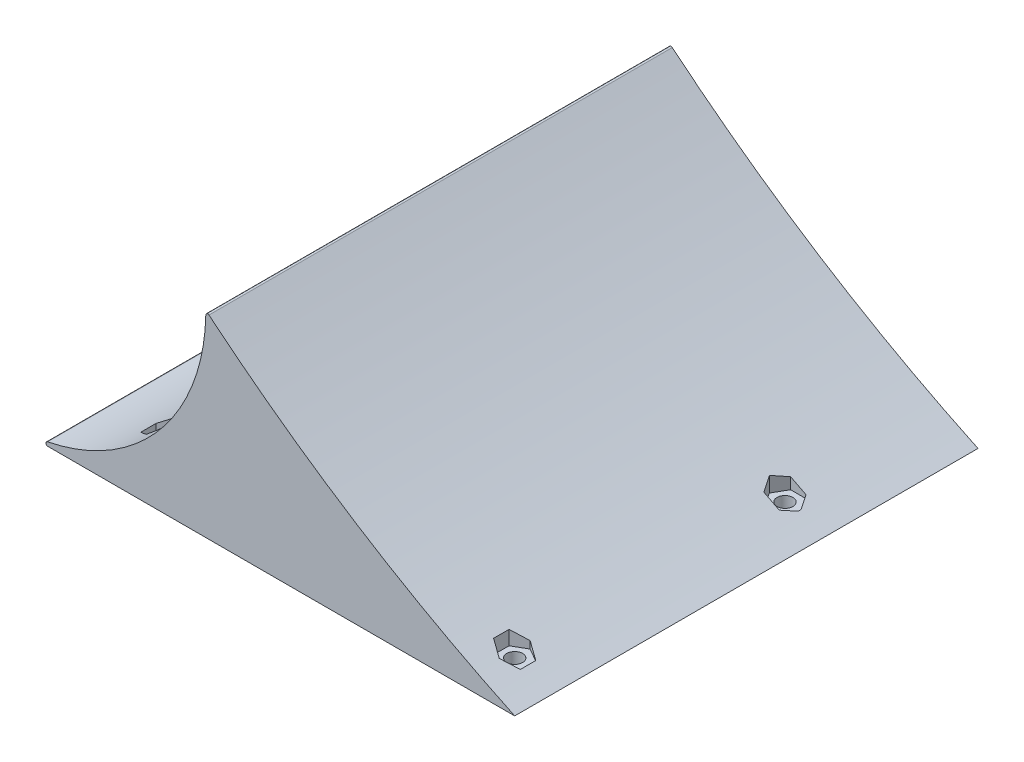
ISO-10303-21;
HEADER;
FILE_DESCRIPTION(('STEP AP214'),'2;1');
FILE_NAME('part.step','',(''),(''),'','','');
FILE_SCHEMA(('AUTOMOTIVE_DESIGN { 1 0 10303 214 1 1 1 1 }'));
ENDSEC;
DATA;
#1=APPLICATION_CONTEXT('core data for automotive mechanical design processes');
#2=APPLICATION_PROTOCOL_DEFINITION('international standard','automotive_design',2000,#1);
#3=PRODUCT_CONTEXT('',#1,'mechanical');
#4=PRODUCT('Part','Part','',(#3));
#5=PRODUCT_RELATED_PRODUCT_CATEGORY('part','',(#4));
#6=PRODUCT_DEFINITION_FORMATION('','',#4);
#7=PRODUCT_DEFINITION_CONTEXT('part definition',#1,'design');
#8=PRODUCT_DEFINITION('design','',#6,#7);
#9=PRODUCT_DEFINITION_SHAPE('','',#8);
#10=(LENGTH_UNIT() NAMED_UNIT(*) SI_UNIT(.MILLI.,.METRE.));
#11=(NAMED_UNIT(*) PLANE_ANGLE_UNIT() SI_UNIT($,.RADIAN.));
#12=(NAMED_UNIT(*) SI_UNIT($,.STERADIAN.) SOLID_ANGLE_UNIT());
#13=UNCERTAINTY_MEASURE_WITH_UNIT(LENGTH_MEASURE(1.E-05),#10,'distance_accuracy_value','');
#14=(GEOMETRIC_REPRESENTATION_CONTEXT(3) GLOBAL_UNCERTAINTY_ASSIGNED_CONTEXT((#13)) GLOBAL_UNIT_ASSIGNED_CONTEXT((#10,
#11,#12)) REPRESENTATION_CONTEXT('',''));
#15=CARTESIAN_POINT('',(0.,0.,0.));
#16=DIRECTION('',(0.,0.,1.));
#17=DIRECTION('',(1.,0.,0.));
#18=AXIS2_PLACEMENT_3D('',#15,#16,#17);
#19=CARTESIAN_POINT('',(0.,-51.,120.));
#20=DIRECTION('',(0.,-1.,0.));
#21=DIRECTION('',(1.,0.,0.));
#22=AXIS2_PLACEMENT_3D('',#19,#20,#21);
#23=PLANE('',#22);
#24=DIRECTION('',(-1.,0.,0.));
#25=VECTOR('',#24,1.);
#26=CARTESIAN_POINT('',(0.,-51.,0.));
#27=LINE('',#26,#25);
#28=CARTESIAN_POINT('',(131.,-51.,0.));
#29=VERTEX_POINT('',#28);
#30=CARTESIAN_POINT('',(10.0995049383621,-51.,0.));
#31=VERTEX_POINT('',#30);
#32=EDGE_CURVE('E423',#29,#31,#27,.T.);
#33=ORIENTED_EDGE('',*,*,#32,.F.);
#34=DIRECTION('',(0.,0.,-1.));
#35=VECTOR('',#34,1.);
#36=CARTESIAN_POINT('',(131.,-51.,120.));
#37=LINE('',#36,#35);
#38=CARTESIAN_POINT('',(131.,-51.,120.));
#39=VERTEX_POINT('',#38);
#40=EDGE_CURVE('E209',#39,#29,#37,.T.);
#41=ORIENTED_EDGE('',*,*,#40,.F.);
#42=DIRECTION('',(-1.,0.,0.));
#43=VECTOR('',#42,1.);
#44=CARTESIAN_POINT('',(0.,-51.,120.));
#45=LINE('',#44,#43);
#46=CARTESIAN_POINT('',(10.0995049383621,-51.,120.));
#47=VERTEX_POINT('',#46);
#48=EDGE_CURVE('E389',#39,#47,#45,.T.);
#49=ORIENTED_EDGE('',*,*,#48,.T.);
#50=DIRECTION('',(0.,0.,-1.));
#51=VECTOR('',#50,1.);
#52=CARTESIAN_POINT('',(10.0995049383621,-51.,120.));
#53=LINE('',#52,#51);
#54=EDGE_CURVE('E398',#47,#31,#53,.T.);
#55=ORIENTED_EDGE('',*,*,#54,.T.);
#56=EDGE_LOOP('',(#33,#41,#49,#55));
#57=FACE_BOUND('',#56,.T.);
#58=CARTESIAN_POINT('',(121.,-51.,110.));
#59=DIRECTION('',(0.,-1.,0.));
#60=DIRECTION('',(1.,0.,0.));
#61=AXIS2_PLACEMENT_3D('',#58,#59,#60);
#62=CIRCLE('',#61,2.05000000000001);
#63=CARTESIAN_POINT('',(123.05,-51.,110.));
#64=VERTEX_POINT('',#63);
#65=EDGE_CURVE('E282',#64,#64,#62,.F.);
#66=ORIENTED_EDGE('',*,*,#65,.T.);
#67=EDGE_LOOP('',(#66));
#68=FACE_BOUND('',#67,.T.);
#69=CARTESIAN_POINT('',(121.,-51.,40.));
#70=DIRECTION('',(0.,-1.,0.));
#71=DIRECTION('',(1.,0.,0.));
#72=AXIS2_PLACEMENT_3D('',#69,#70,#71);
#73=CIRCLE('',#72,2.04999999999999);
#74=CARTESIAN_POINT('',(123.05,-51.,40.));
#75=VERTEX_POINT('',#74);
#76=EDGE_CURVE('E283',#75,#75,#73,.T.);
#77=ORIENTED_EDGE('',*,*,#76,.F.);
#78=EDGE_LOOP('',(#77));
#79=FACE_BOUND('',#78,.T.);
#80=CARTESIAN_POINT('',(29.5995049383621,-51.,110.));
#81=DIRECTION('',(0.,-1.,0.));
#82=DIRECTION('',(1.,0.,0.));
#83=AXIS2_PLACEMENT_3D('',#80,#81,#82);
#84=CIRCLE('',#83,2.05000000000001);
#85=CARTESIAN_POINT('',(31.6495049383621,-51.,110.));
#86=VERTEX_POINT('',#85);
#87=EDGE_CURVE('E279',#86,#86,#84,.T.);
#88=ORIENTED_EDGE('',*,*,#87,.F.);
#89=EDGE_LOOP('',(#88));
#90=FACE_BOUND('',#89,.T.);
#91=ADVANCED_FACE('F42',(#57,#68,#79,#90),#23,.T.);
#92=CARTESIAN_POINT('',(0.,0.,120.));
#93=DIRECTION('',(0.,0.,-1.));
#94=DIRECTION('',(-1.,0.,0.));
#95=AXIS2_PLACEMENT_3D('',#92,#93,#94);
#96=CYLINDRICAL_SURFACE('',#95,51.);
#97=CARTESIAN_POINT('',(0.,0.,0.));
#98=DIRECTION('',(0.,0.,1.));
#99=DIRECTION('',(1.,0.,0.));
#100=AXIS2_PLACEMENT_3D('',#97,#98,#99);
#101=CIRCLE('',#100,51.);
#102=CARTESIAN_POINT('',(10.0014514923586,-50.0097087378641,0.));
#103=VERTEX_POINT('',#102);
#104=CARTESIAN_POINT('',(50.9892838253327,-1.04543530630317,0.));
#105=VERTEX_POINT('',#104);
#106=EDGE_CURVE('E57',#103,#105,#101,.T.);
#107=ORIENTED_EDGE('',*,*,#106,.F.);
#108=DIRECTION('',(0.,0.,-1.));
#109=VECTOR('',#108,1.);
#110=CARTESIAN_POINT('',(10.0014514923586,-50.0097087378641,120.));
#111=LINE('',#110,#109);
#112=CARTESIAN_POINT('',(10.0014514923586,-50.0097087378641,120.));
#113=VERTEX_POINT('',#112);
#114=EDGE_CURVE('E405',#103,#113,#111,.F.);
#115=ORIENTED_EDGE('',*,*,#114,.T.);
#116=CARTESIAN_POINT('',(0.,0.,120.));
#117=DIRECTION('',(0.,0.,1.));
#118=DIRECTION('',(1.,0.,0.));
#119=AXIS2_PLACEMENT_3D('',#116,#117,#118);
#120=CIRCLE('',#119,51.);
#121=CARTESIAN_POINT('',(50.9892838253327,-1.04543530630317,120.));
#122=VERTEX_POINT('',#121);
#123=EDGE_CURVE('E385',#113,#122,#120,.T.);
#124=ORIENTED_EDGE('',*,*,#123,.T.);
#125=DIRECTION('',(0.,0.,-1.));
#126=VECTOR('',#125,1.);
#127=CARTESIAN_POINT('',(50.9892838253327,-1.04543530630317,120.));
#128=LINE('',#127,#126);
#129=EDGE_CURVE('E402',#122,#105,#128,.T.);
#130=ORIENTED_EDGE('',*,*,#129,.T.);
#131=EDGE_LOOP('',(#107,#115,#124,#130));
#132=FACE_BOUND('',#131,.T.);
#133=CARTESIAN_POINT('',(0.,0.,123.089282144043));
#134=DIRECTION('',(-0.500000000000002,0.,-0.866025403784438));
#135=DIRECTION('',(0.866025403784438,0.,-0.500000000000002));
#136=AXIS2_PLACEMENT_3D('',#133,#134,#135);
#137=ELLIPSE('',#136,58.8897274573419,51.);
#138=CARTESIAN_POINT('',(29.5995049383621,-41.5315459308208,106.));
#139=VERTEX_POINT('',#138);
#140=CARTESIAN_POINT('',(26.1354033232243,-43.794299778994,108.));
#141=VERTEX_POINT('',#140);
#142=EDGE_CURVE('E51',#139,#141,#137,.T.);
#143=ORIENTED_EDGE('',*,*,#142,.F.);
#144=CARTESIAN_POINT('',(0.,0.,88.9107178559569));
#145=DIRECTION('',(0.500000000000002,0.,-0.866025403784438));
#146=DIRECTION('',(-0.866025403784438,0.,-0.500000000000002));
#147=AXIS2_PLACEMENT_3D('',#144,#145,#146);
#148=ELLIPSE('',#147,58.8897274573419,51.);
#149=CARTESIAN_POINT('',(33.0636065534998,-38.830373699919,108.));
#150=VERTEX_POINT('',#149);
#151=EDGE_CURVE('E262',#150,#139,#148,.T.);
#152=ORIENTED_EDGE('',*,*,#151,.F.);
#153=DIRECTION('',(0.,0.,-1.));
#154=VECTOR('',#153,1.);
#155=CARTESIAN_POINT('',(33.0636065534998,-38.830373699919,120.));
#156=LINE('',#155,#154);
#157=CARTESIAN_POINT('',(33.0636065534998,-38.830373699919,112.));
#158=VERTEX_POINT('',#157);
#159=EDGE_CURVE('E265',#158,#150,#156,.T.);
#160=ORIENTED_EDGE('',*,*,#159,.F.);
#161=CARTESIAN_POINT('',(0.,0.,131.089282144043));
#162=DIRECTION('',(0.499999999999999,0.,0.866025403784439));
#163=DIRECTION('',(0.866025403784439,0.,-0.499999999999999));
#164=AXIS2_PLACEMENT_3D('',#161,#162,#163);
#165=ELLIPSE('',#164,58.8897274573418,51.);
#166=CARTESIAN_POINT('',(29.5995049383621,-41.5315459308208,114.));
#167=VERTEX_POINT('',#166);
#168=EDGE_CURVE('E268',#167,#158,#165,.T.);
#169=ORIENTED_EDGE('',*,*,#168,.F.);
#170=CARTESIAN_POINT('',(0.,0.,96.910717855957));
#171=DIRECTION('',(-0.499999999999999,0.,0.866025403784439));
#172=DIRECTION('',(-0.866025403784439,0.,-0.499999999999999));
#173=AXIS2_PLACEMENT_3D('',#170,#171,#172);
#174=ELLIPSE('',#173,58.8897274573418,51.);
#175=CARTESIAN_POINT('',(26.1354033232243,-43.794299778994,112.));
#176=VERTEX_POINT('',#175);
#177=EDGE_CURVE('E271',#176,#167,#174,.T.);
#178=ORIENTED_EDGE('',*,*,#177,.F.);
#179=DIRECTION('',(0.,0.,-1.));
#180=VECTOR('',#179,1.);
#181=CARTESIAN_POINT('',(26.1354033232243,-43.794299778994,120.));
#182=LINE('',#181,#180);
#183=EDGE_CURVE('E274',#141,#176,#182,.F.);
#184=ORIENTED_EDGE('',*,*,#183,.F.);
#185=EDGE_LOOP('',(#143,#152,#160,#169,#178,#184));
#186=FACE_BOUND('',#185,.T.);
#187=ADVANCED_FACE('F414',(#132,#186),#96,.F.);
#188=CARTESIAN_POINT('',(291.444081503328,288.922088632672,120.));
#189=DIRECTION('',(0.,0.,-1.));
#190=DIRECTION('',(-1.,0.,0.));
#191=AXIS2_PLACEMENT_3D('',#188,#189,#190);
#192=CYLINDRICAL_SURFACE('',#191,375.884729178833);
#193=CARTESIAN_POINT('',(291.444081503328,288.922088632672,0.));
#194=DIRECTION('',(0.,0.,1.));
#195=DIRECTION('',(1.,0.,0.));
#196=AXIS2_PLACEMENT_3D('',#193,#194,#195);
#197=CIRCLE('',#196,375.884729178833);
#198=CARTESIAN_POINT('',(51.8079415680354,-0.670470088641643,0.));
#199=VERTEX_POINT('',#198);
#200=EDGE_CURVE('E196',#199,#29,#197,.T.);
#201=ORIENTED_EDGE('',*,*,#200,.F.);
#202=DIRECTION('',(0.,0.,-1.));
#203=VECTOR('',#202,1.);
#204=CARTESIAN_POINT('',(51.8079415680354,-0.670470088641684,120.));
#205=LINE('',#204,#203);
#206=CARTESIAN_POINT('',(51.8079415680354,-0.670470088641628,120.));
#207=VERTEX_POINT('',#206);
#208=EDGE_CURVE('E206',#199,#207,#205,.F.);
#209=ORIENTED_EDGE('',*,*,#208,.T.);
#210=CARTESIAN_POINT('',(291.444081503328,288.922088632672,120.));
#211=DIRECTION('',(0.,0.,1.));
#212=DIRECTION('',(1.,0.,0.));
#213=AXIS2_PLACEMENT_3D('',#210,#211,#212);
#214=CIRCLE('',#213,375.884729178833);
#215=EDGE_CURVE('E393',#207,#39,#214,.T.);
#216=ORIENTED_EDGE('',*,*,#215,.T.);
#217=ORIENTED_EDGE('',*,*,#40,.T.);
#218=EDGE_LOOP('',(#201,#209,#216,#217));
#219=FACE_BOUND('',#218,.T.);
#220=CARTESIAN_POINT('',(291.444081503328,288.922088632672,-262.146012243449));
#221=DIRECTION('',(-0.866025403784438,0.,-0.500000000000002));
#222=DIRECTION('',(0.500000000000002,0.,-0.866025403784438));
#223=AXIS2_PLACEMENT_3D('',#220,#221,#222);
#224=ELLIPSE('',#223,751.769458357663,375.884729178833);
#225=CARTESIAN_POINT('',(119.,-45.0724747726598,36.5358983848623));
#226=VERTEX_POINT('',#225);
#227=CARTESIAN_POINT('',(117.,-44.0322506667354,40.));
#228=VERTEX_POINT('',#227);
#229=EDGE_CURVE('E259',#226,#228,#224,.T.);
#230=ORIENTED_EDGE('',*,*,#229,.F.);
#231=CARTESIAN_POINT('',(291.444081503328,288.922088632672,36.5358983848623));
#232=DIRECTION('',(0.,0.,-1.));
#233=DIRECTION('',(-1.,0.,0.));
#234=AXIS2_PLACEMENT_3D('',#231,#232,#233);
#235=CIRCLE('',#234,375.884729178833);
#236=CARTESIAN_POINT('',(123.,-47.1075544590422,36.5358983848623));
#237=VERTEX_POINT('',#236);
#238=EDGE_CURVE('E243',#237,#226,#235,.T.);
#239=ORIENTED_EDGE('',*,*,#238,.F.);
#240=CARTESIAN_POINT('',(291.444081503328,288.922088632672,328.289605782896));
#241=DIRECTION('',(0.866025403784436,0.,-0.500000000000004));
#242=DIRECTION('',(-0.500000000000004,0.,-0.866025403784436));
#243=AXIS2_PLACEMENT_3D('',#240,#241,#242);
#244=ELLIPSE('',#243,751.769458357659,375.884729178833);
#245=CARTESIAN_POINT('',(124.792241365745,-48.,39.640151489759));
#246=VERTEX_POINT('',#245);
#247=EDGE_CURVE('E240',#246,#237,#244,.T.);
#248=ORIENTED_EDGE('',*,*,#247,.F.);
#249=DIRECTION('',(0.,0.,-1.));
#250=VECTOR('',#249,1.);
#251=CARTESIAN_POINT('',(124.792241365745,-48.,120.));
#252=LINE('',#251,#250);
#253=CARTESIAN_POINT('',(124.792241365745,-48.,40.3598485102411));
#254=VERTEX_POINT('',#253);
#255=EDGE_CURVE('E246',#254,#246,#252,.T.);
#256=ORIENTED_EDGE('',*,*,#255,.F.);
#257=CARTESIAN_POINT('',(291.444081503328,288.922088632672,-248.289605782895));
#258=DIRECTION('',(0.866025403784435,0.,0.500000000000006));
#259=DIRECTION('',(0.500000000000006,0.,-0.866025403784435));
#260=AXIS2_PLACEMENT_3D('',#257,#258,#259);
#261=ELLIPSE('',#260,751.769458357657,375.884729178833);
#262=CARTESIAN_POINT('',(123.,-47.1075544590422,43.4641016151377));
#263=VERTEX_POINT('',#262);
#264=EDGE_CURVE('E250',#263,#254,#261,.T.);
#265=ORIENTED_EDGE('',*,*,#264,.F.);
#266=CARTESIAN_POINT('',(291.444081503328,288.922088632672,43.4641016151377));
#267=DIRECTION('',(0.,0.,1.));
#268=DIRECTION('',(1.,0.,0.));
#269=AXIS2_PLACEMENT_3D('',#266,#267,#268);
#270=CIRCLE('',#269,375.884729178833);
#271=CARTESIAN_POINT('',(119.,-45.0724747726599,43.4641016151377));
#272=VERTEX_POINT('',#271);
#273=EDGE_CURVE('E253',#272,#263,#270,.T.);
#274=ORIENTED_EDGE('',*,*,#273,.F.);
#275=CARTESIAN_POINT('',(291.444081503328,288.922088632672,342.146012243452));
#276=DIRECTION('',(-0.86602540378444,0.,0.499999999999998));
#277=DIRECTION('',(-0.499999999999998,0.,-0.86602540378444));
#278=AXIS2_PLACEMENT_3D('',#275,#276,#277);
#279=ELLIPSE('',#278,751.769458357668,375.884729178833);
#280=EDGE_CURVE('E256',#228,#272,#279,.T.);
#281=ORIENTED_EDGE('',*,*,#280,.F.);
#282=EDGE_LOOP('',(#230,#239,#248,#256,#265,#274,#281));
#283=FACE_BOUND('',#282,.T.);
#284=DIRECTION('',(0.,0.,-1.));
#285=VECTOR('',#284,1.);
#286=CARTESIAN_POINT('',(124.464101615138,-47.8374931855507,120.));
#287=LINE('',#286,#285);
#288=CARTESIAN_POINT('',(124.464101615138,-47.8374931855507,112.));
#289=VERTEX_POINT('',#288);
#290=CARTESIAN_POINT('',(124.464101615138,-47.8374931855508,108.));
#291=VERTEX_POINT('',#290);
#292=EDGE_CURVE('E237',#289,#291,#287,.T.);
#293=ORIENTED_EDGE('',*,*,#292,.F.);
#294=CARTESIAN_POINT('',(291.444081503328,288.922088632672,15.5940636622761));
#295=DIRECTION('',(0.499999999999996,0.,0.866025403784441));
#296=DIRECTION('',(0.866025403784441,0.,-0.499999999999996));
#297=AXIS2_PLACEMENT_3D('',#294,#295,#296);
#298=ELLIPSE('',#297,434.034299151336,375.884729178833);
#299=CARTESIAN_POINT('',(121.,-46.0975297635221,114.));
#300=VERTEX_POINT('',#299);
#301=EDGE_CURVE('E215',#300,#289,#298,.T.);
#302=ORIENTED_EDGE('',*,*,#301,.F.);
#303=CARTESIAN_POINT('',(291.444081503328,288.922088632672,212.405936337725));
#304=DIRECTION('',(-0.5,0.,0.866025403784438));
#305=DIRECTION('',(-0.866025403784438,0.,-0.5));
#306=AXIS2_PLACEMENT_3D('',#303,#304,#305);
#307=ELLIPSE('',#306,434.034299151338,375.884729178833);
#308=CARTESIAN_POINT('',(117.535898384862,-44.312473611821,112.));
#309=VERTEX_POINT('',#308);
#310=EDGE_CURVE('E220',#309,#300,#307,.T.);
#311=ORIENTED_EDGE('',*,*,#310,.F.);
#312=DIRECTION('',(0.,0.,-1.));
#313=VECTOR('',#312,1.);
#314=CARTESIAN_POINT('',(117.535898384862,-44.3124736118209,120.));
#315=LINE('',#314,#313);
#316=CARTESIAN_POINT('',(117.535898384862,-44.3124736118209,108.));
#317=VERTEX_POINT('',#316);
#318=EDGE_CURVE('E228',#317,#309,#315,.F.);
#319=ORIENTED_EDGE('',*,*,#318,.F.);
#320=CARTESIAN_POINT('',(291.444081503328,288.922088632672,7.59406366227533));
#321=DIRECTION('',(-0.499999999999999,0.,-0.866025403784439));
#322=DIRECTION('',(0.866025403784439,0.,-0.499999999999999));
#323=AXIS2_PLACEMENT_3D('',#320,#321,#322);
#324=ELLIPSE('',#323,434.034299151337,375.884729178833);
#325=CARTESIAN_POINT('',(121.,-46.0975297635221,106.));
#326=VERTEX_POINT('',#325);
#327=EDGE_CURVE('E231',#326,#317,#324,.T.);
#328=ORIENTED_EDGE('',*,*,#327,.F.);
#329=CARTESIAN_POINT('',(291.444081503328,288.922088632672,204.405936337724));
#330=DIRECTION('',(0.499999999999997,0.,-0.86602540378444));
#331=DIRECTION('',(-0.86602540378444,0.,-0.499999999999998));
#332=AXIS2_PLACEMENT_3D('',#329,#330,#331);
#333=ELLIPSE('',#332,434.034299151337,375.884729178833);
#334=EDGE_CURVE('E234',#291,#326,#333,.T.);
#335=ORIENTED_EDGE('',*,*,#334,.F.);
#336=EDGE_LOOP('',(#293,#302,#311,#319,#328,#335));
#337=FACE_BOUND('',#336,.T.);
#338=ADVANCED_FACE('F204',(#219,#283,#337),#192,.F.);
#339=CARTESIAN_POINT('',(0.,0.,120.));
#340=DIRECTION('',(0.,0.,1.));
#341=DIRECTION('',(1.,0.,0.));
#342=AXIS2_PLACEMENT_3D('',#339,#340,#341);
#343=PLANE('',#342);
#344=ORIENTED_EDGE('',*,*,#123,.F.);
#345=CARTESIAN_POINT('',(10.0995049383621,-50.5,120.));
#346=DIRECTION('',(0.,0.,1.));
#347=DIRECTION('',(1.,0.,0.));
#348=AXIS2_PLACEMENT_3D('',#345,#346,#347);
#349=CIRCLE('',#348,0.5);
#350=EDGE_CURVE('E216',#113,#47,#349,.T.);
#351=ORIENTED_EDGE('',*,*,#350,.T.);
#352=ORIENTED_EDGE('',*,*,#48,.F.);
#353=ORIENTED_EDGE('',*,*,#215,.F.);
#354=CARTESIAN_POINT('',(51.4891787647967,-1.05568467205124,120.));
#355=DIRECTION('',(0.,0.,1.));
#356=DIRECTION('',(1.,0.,0.));
#357=AXIS2_PLACEMENT_3D('',#354,#355,#356);
#358=CIRCLE('',#357,0.5);
#359=EDGE_CURVE('E213',#207,#122,#358,.T.);
#360=ORIENTED_EDGE('',*,*,#359,.T.);
#361=EDGE_LOOP('',(#344,#351,#352,#353,#360));
#362=FACE_BOUND('',#361,.T.);
#363=ADVANCED_FACE('F410',(#362),#343,.T.);
#364=CARTESIAN_POINT('',(10.0995049383621,-50.5,120.));
#365=DIRECTION('',(0.,0.,-1.));
#366=DIRECTION('',(-1.,0.,0.));
#367=AXIS2_PLACEMENT_3D('',#364,#365,#366);
#368=CYLINDRICAL_SURFACE('',#367,0.5);
#369=CARTESIAN_POINT('',(10.0995049383621,-50.5,0.));
#370=DIRECTION('',(0.,0.,1.));
#371=DIRECTION('',(1.,0.,0.));
#372=AXIS2_PLACEMENT_3D('',#369,#370,#371);
#373=CIRCLE('',#372,0.5);
#374=EDGE_CURVE('E421',#31,#103,#373,.F.);
#375=ORIENTED_EDGE('',*,*,#374,.F.);
#376=ORIENTED_EDGE('',*,*,#54,.F.);
#377=ORIENTED_EDGE('',*,*,#350,.F.);
#378=ORIENTED_EDGE('',*,*,#114,.F.);
#379=EDGE_LOOP('',(#375,#376,#377,#378));
#380=FACE_BOUND('',#379,.T.);
#381=ADVANCED_FACE('F419',(#380),#368,.T.);
#382=CARTESIAN_POINT('',(51.4891787647967,-1.05568467205124,120.));
#383=DIRECTION('',(0.,0.,-1.));
#384=DIRECTION('',(-1.,0.,0.));
#385=AXIS2_PLACEMENT_3D('',#382,#383,#384);
#386=CYLINDRICAL_SURFACE('',#385,0.5);
#387=CARTESIAN_POINT('',(51.4891787647967,-1.05568467205124,0.));
#388=DIRECTION('',(0.,0.,1.));
#389=DIRECTION('',(1.,0.,0.));
#390=AXIS2_PLACEMENT_3D('',#387,#388,#389);
#391=CIRCLE('',#390,0.5);
#392=EDGE_CURVE('E12',#105,#199,#391,.F.);
#393=ORIENTED_EDGE('',*,*,#392,.F.);
#394=ORIENTED_EDGE('',*,*,#129,.F.);
#395=ORIENTED_EDGE('',*,*,#359,.F.);
#396=ORIENTED_EDGE('',*,*,#208,.F.);
#397=EDGE_LOOP('',(#393,#394,#395,#396));
#398=FACE_BOUND('',#397,.T.);
#399=ADVANCED_FACE('F44',(#398),#386,.T.);
#400=CARTESIAN_POINT('',(0.,-48.,120.));
#401=DIRECTION('',(0.,-1.,0.));
#402=DIRECTION('',(1.,0.,0.));
#403=AXIS2_PLACEMENT_3D('',#400,#401,#402);
#404=PLANE('',#403);
#405=CARTESIAN_POINT('',(121.,-48.,110.));
#406=DIRECTION('',(0.,-1.,0.));
#407=DIRECTION('',(1.,0.,0.));
#408=AXIS2_PLACEMENT_3D('',#405,#406,#407);
#409=CIRCLE('',#408,2.05000000000001);
#410=CARTESIAN_POINT('',(123.05,-48.,110.));
#411=VERTEX_POINT('',#410);
#412=EDGE_CURVE('E432',#411,#411,#409,.T.);
#413=ORIENTED_EDGE('',*,*,#412,.T.);
#414=EDGE_LOOP('',(#413));
#415=FACE_BOUND('',#414,.T.);
#416=DIRECTION('',(0.866025403784441,0.,-0.499999999999996));
#417=VECTOR('',#416,1.);
#418=CARTESIAN_POINT('',(121.,-48.,114.));
#419=LINE('',#418,#417);
#420=CARTESIAN_POINT('',(121.,-48.,114.));
#421=VERTEX_POINT('',#420);
#422=CARTESIAN_POINT('',(124.464101615138,-48.,112.));
#423=VERTEX_POINT('',#422);
#424=EDGE_CURVE('E343',#421,#423,#419,.T.);
#425=ORIENTED_EDGE('',*,*,#424,.T.);
#426=DIRECTION('',(0.,0.,-1.));
#427=VECTOR('',#426,1.);
#428=CARTESIAN_POINT('',(124.464101615138,-48.,112.));
#429=LINE('',#428,#427);
#430=CARTESIAN_POINT('',(124.464101615138,-48.,108.));
#431=VERTEX_POINT('',#430);
#432=EDGE_CURVE('E338',#423,#431,#429,.T.);
#433=ORIENTED_EDGE('',*,*,#432,.T.);
#434=DIRECTION('',(-0.86602540378444,0.,-0.499999999999998));
#435=VECTOR('',#434,1.);
#436=CARTESIAN_POINT('',(124.464101615138,-48.,108.));
#437=LINE('',#436,#435);
#438=CARTESIAN_POINT('',(121.,-48.,106.));
#439=VERTEX_POINT('',#438);
#440=EDGE_CURVE('E364',#431,#439,#437,.T.);
#441=ORIENTED_EDGE('',*,*,#440,.T.);
#442=DIRECTION('',(-0.866025403784439,0.,0.499999999999999));
#443=VECTOR('',#442,1.);
#444=CARTESIAN_POINT('',(121.,-48.,106.));
#445=LINE('',#444,#443);
#446=CARTESIAN_POINT('',(117.535898384862,-48.,108.));
#447=VERTEX_POINT('',#446);
#448=EDGE_CURVE('E359',#439,#447,#445,.T.);
#449=ORIENTED_EDGE('',*,*,#448,.T.);
#450=DIRECTION('',(0.,0.,1.));
#451=VECTOR('',#450,1.);
#452=CARTESIAN_POINT('',(117.535898384862,-48.,108.));
#453=LINE('',#452,#451);
#454=CARTESIAN_POINT('',(117.535898384862,-48.,112.));
#455=VERTEX_POINT('',#454);
#456=EDGE_CURVE('E354',#447,#455,#453,.T.);
#457=ORIENTED_EDGE('',*,*,#456,.T.);
#458=DIRECTION('',(0.866025403784438,0.,0.5));
#459=VECTOR('',#458,1.);
#460=CARTESIAN_POINT('',(117.535898384862,-48.,112.));
#461=LINE('',#460,#459);
#462=EDGE_CURVE('E349',#455,#421,#461,.T.);
#463=ORIENTED_EDGE('',*,*,#462,.T.);
#464=EDGE_LOOP('',(#425,#433,#441,#449,#457,#463));
#465=FACE_BOUND('',#464,.T.);
#466=ADVANCED_FACE('F534',(#415,#465),#404,.F.);
#467=CARTESIAN_POINT('',(124.464101615138,-61.5830052442584,112.));
#468=DIRECTION('',(1.,0.,0.));
#469=DIRECTION('',(0.,0.,-1.));
#470=AXIS2_PLACEMENT_3D('',#467,#468,#469);
#471=PLANE('',#470);
#472=ORIENTED_EDGE('',*,*,#292,.T.);
#473=DIRECTION('',(0.,1.,0.));
#474=VECTOR('',#473,1.);
#475=CARTESIAN_POINT('',(124.464101615138,-61.5830052442584,108.));
#476=LINE('',#475,#474);
#477=EDGE_CURVE('E342',#431,#291,#476,.T.);
#478=ORIENTED_EDGE('',*,*,#477,.F.);
#479=ORIENTED_EDGE('',*,*,#432,.F.);
#480=DIRECTION('',(0.,1.,0.));
#481=VECTOR('',#480,1.);
#482=CARTESIAN_POINT('',(124.464101615138,-61.5830052442584,112.));
#483=LINE('',#482,#481);
#484=EDGE_CURVE('E347',#423,#289,#483,.T.);
#485=ORIENTED_EDGE('',*,*,#484,.T.);
#486=EDGE_LOOP('',(#472,#478,#479,#485));
#487=FACE_BOUND('',#486,.T.);
#488=ADVANCED_FACE('F542',(#487),#471,.F.);
#489=CARTESIAN_POINT('',(124.464101615138,-61.5830052442584,108.));
#490=DIRECTION('',(0.499999999999997,0.,-0.86602540378444));
#491=DIRECTION('',(-0.86602540378444,0.,-0.499999999999998));
#492=AXIS2_PLACEMENT_3D('',#489,#490,#491);
#493=PLANE('',#492);
#494=ORIENTED_EDGE('',*,*,#334,.T.);
#495=DIRECTION('',(0.,1.,0.));
#496=VECTOR('',#495,1.);
#497=CARTESIAN_POINT('',(121.,-61.5830052442584,106.));
#498=LINE('',#497,#496);
#499=EDGE_CURVE('E363',#439,#326,#498,.T.);
#500=ORIENTED_EDGE('',*,*,#499,.F.);
#501=ORIENTED_EDGE('',*,*,#440,.F.);
#502=ORIENTED_EDGE('',*,*,#477,.T.);
#503=EDGE_LOOP('',(#494,#500,#501,#502));
#504=FACE_BOUND('',#503,.T.);
#505=ADVANCED_FACE('F546',(#504),#493,.F.);
#506=CARTESIAN_POINT('',(121.,-61.5830052442584,106.));
#507=DIRECTION('',(-0.499999999999999,0.,-0.866025403784439));
#508=DIRECTION('',(-0.866025403784439,0.,0.499999999999999));
#509=AXIS2_PLACEMENT_3D('',#506,#507,#508);
#510=PLANE('',#509);
#511=ORIENTED_EDGE('',*,*,#327,.T.);
#512=DIRECTION('',(0.,1.,0.));
#513=VECTOR('',#512,1.);
#514=CARTESIAN_POINT('',(117.535898384862,-61.5830052442584,108.));
#515=LINE('',#514,#513);
#516=EDGE_CURVE('E358',#447,#317,#515,.T.);
#517=ORIENTED_EDGE('',*,*,#516,.F.);
#518=ORIENTED_EDGE('',*,*,#448,.F.);
#519=ORIENTED_EDGE('',*,*,#499,.T.);
#520=EDGE_LOOP('',(#511,#517,#518,#519));
#521=FACE_BOUND('',#520,.T.);
#522=ADVANCED_FACE('F550',(#521),#510,.F.);
#523=CARTESIAN_POINT('',(117.535898384862,-61.5830052442584,108.));
#524=DIRECTION('',(-1.,0.,0.));
#525=DIRECTION('',(0.,0.,1.));
#526=AXIS2_PLACEMENT_3D('',#523,#524,#525);
#527=PLANE('',#526);
#528=ORIENTED_EDGE('',*,*,#318,.T.);
#529=DIRECTION('',(0.,1.,0.));
#530=VECTOR('',#529,1.);
#531=CARTESIAN_POINT('',(117.535898384862,-61.5830052442584,112.));
#532=LINE('',#531,#530);
#533=EDGE_CURVE('E353',#455,#309,#532,.T.);
#534=ORIENTED_EDGE('',*,*,#533,.F.);
#535=ORIENTED_EDGE('',*,*,#456,.F.);
#536=ORIENTED_EDGE('',*,*,#516,.T.);
#537=EDGE_LOOP('',(#528,#534,#535,#536));
#538=FACE_BOUND('',#537,.T.);
#539=ADVANCED_FACE('F554',(#538),#527,.F.);
#540=CARTESIAN_POINT('',(117.535898384862,-61.5830052442584,112.));
#541=DIRECTION('',(-0.5,0.,0.866025403784438));
#542=DIRECTION('',(0.866025403784438,0.,0.5));
#543=AXIS2_PLACEMENT_3D('',#540,#541,#542);
#544=PLANE('',#543);
#545=ORIENTED_EDGE('',*,*,#310,.T.);
#546=DIRECTION('',(0.,1.,0.));
#547=VECTOR('',#546,1.);
#548=CARTESIAN_POINT('',(121.,-61.5830052442584,114.));
#549=LINE('',#548,#547);
#550=EDGE_CURVE('E348',#421,#300,#549,.T.);
#551=ORIENTED_EDGE('',*,*,#550,.F.);
#552=ORIENTED_EDGE('',*,*,#462,.F.);
#553=ORIENTED_EDGE('',*,*,#533,.T.);
#554=EDGE_LOOP('',(#545,#551,#552,#553));
#555=FACE_BOUND('',#554,.T.);
#556=ADVANCED_FACE('F558',(#555),#544,.F.);
#557=CARTESIAN_POINT('',(121.,-61.5830052442584,114.));
#558=DIRECTION('',(0.499999999999996,0.,0.866025403784441));
#559=DIRECTION('',(0.866025403784441,0.,-0.499999999999996));
#560=AXIS2_PLACEMENT_3D('',#557,#558,#559);
#561=PLANE('',#560);
#562=ORIENTED_EDGE('',*,*,#301,.T.);
#563=ORIENTED_EDGE('',*,*,#484,.F.);
#564=ORIENTED_EDGE('',*,*,#424,.F.);
#565=ORIENTED_EDGE('',*,*,#550,.T.);
#566=EDGE_LOOP('',(#562,#563,#564,#565));
#567=FACE_BOUND('',#566,.T.);
#568=ADVANCED_FACE('F562',(#567),#561,.F.);
#569=CARTESIAN_POINT('',(0.,-48.,120.));
#570=DIRECTION('',(0.,-1.,0.));
#571=DIRECTION('',(1.,0.,0.));
#572=AXIS2_PLACEMENT_3D('',#569,#570,#571);
#573=PLANE('',#572);
#574=CARTESIAN_POINT('',(121.,-48.,40.));
#575=DIRECTION('',(0.,1.,0.));
#576=DIRECTION('',(-1.,0.,0.));
#577=AXIS2_PLACEMENT_3D('',#574,#575,#576);
#578=CIRCLE('',#577,2.04999999999999);
#579=CARTESIAN_POINT('',(118.95,-48.,40.));
#580=VERTEX_POINT('',#579);
#581=EDGE_CURVE('E428',#580,#580,#578,.T.);
#582=ORIENTED_EDGE('',*,*,#581,.F.);
#583=EDGE_LOOP('',(#582));
#584=FACE_BOUND('',#583,.T.);
#585=ORIENTED_EDGE('',*,*,#255,.T.);
#586=DIRECTION('',(-0.500000000000004,0.,-0.866025403784436));
#587=VECTOR('',#586,1.);
#588=CARTESIAN_POINT('',(125.,-48.,40.));
#589=LINE('',#588,#587);
#590=CARTESIAN_POINT('',(123.,-48.,36.5358983848623));
#591=VERTEX_POINT('',#590);
#592=EDGE_CURVE('E304',#246,#591,#589,.T.);
#593=ORIENTED_EDGE('',*,*,#592,.T.);
#594=DIRECTION('',(-1.,0.,0.));
#595=VECTOR('',#594,1.);
#596=CARTESIAN_POINT('',(123.,-48.,36.5358983848623));
#597=LINE('',#596,#595);
#598=CARTESIAN_POINT('',(119.,-48.,36.5358983848623));
#599=VERTEX_POINT('',#598);
#600=EDGE_CURVE('E286',#591,#599,#597,.T.);
#601=ORIENTED_EDGE('',*,*,#600,.T.);
#602=DIRECTION('',(-0.500000000000002,0.,0.866025403784438));
#603=VECTOR('',#602,1.);
#604=CARTESIAN_POINT('',(119.,-48.,36.5358983848623));
#605=LINE('',#604,#603);
#606=CARTESIAN_POINT('',(117.,-48.,40.));
#607=VERTEX_POINT('',#606);
#608=EDGE_CURVE('E298',#599,#607,#605,.T.);
#609=ORIENTED_EDGE('',*,*,#608,.T.);
#610=DIRECTION('',(0.499999999999998,0.,0.86602540378444));
#611=VECTOR('',#610,1.);
#612=CARTESIAN_POINT('',(117.,-48.,40.));
#613=LINE('',#612,#611);
#614=CARTESIAN_POINT('',(119.,-48.,43.4641016151377));
#615=VERTEX_POINT('',#614);
#616=EDGE_CURVE('E318',#607,#615,#613,.T.);
#617=ORIENTED_EDGE('',*,*,#616,.T.);
#618=DIRECTION('',(1.,0.,0.));
#619=VECTOR('',#618,1.);
#620=CARTESIAN_POINT('',(119.,-48.,43.4641016151377));
#621=LINE('',#620,#619);
#622=CARTESIAN_POINT('',(123.,-48.,43.4641016151377));
#623=VERTEX_POINT('',#622);
#624=EDGE_CURVE('E313',#615,#623,#621,.T.);
#625=ORIENTED_EDGE('',*,*,#624,.T.);
#626=DIRECTION('',(0.500000000000006,0.,-0.866025403784435));
#627=VECTOR('',#626,1.);
#628=CARTESIAN_POINT('',(123.,-48.,43.4641016151377));
#629=LINE('',#628,#627);
#630=EDGE_CURVE('E308',#623,#254,#629,.T.);
#631=ORIENTED_EDGE('',*,*,#630,.T.);
#632=EDGE_LOOP('',(#585,#593,#601,#609,#617,#625,#631));
#633=FACE_BOUND('',#632,.T.);
#634=ADVANCED_FACE('F566',(#584,#633),#573,.F.);
#635=CARTESIAN_POINT('',(123.,-61.5830052442584,36.5358983848623));
#636=DIRECTION('',(0.,0.,-1.));
#637=DIRECTION('',(-1.,0.,0.));
#638=AXIS2_PLACEMENT_3D('',#635,#636,#637);
#639=PLANE('',#638);
#640=ORIENTED_EDGE('',*,*,#238,.T.);
#641=DIRECTION('',(0.,1.,0.));
#642=VECTOR('',#641,1.);
#643=CARTESIAN_POINT('',(119.,-61.5830052442584,36.5358983848623));
#644=LINE('',#643,#642);
#645=EDGE_CURVE('E291',#599,#226,#644,.T.);
#646=ORIENTED_EDGE('',*,*,#645,.F.);
#647=ORIENTED_EDGE('',*,*,#600,.F.);
#648=DIRECTION('',(0.,1.,0.));
#649=VECTOR('',#648,1.);
#650=CARTESIAN_POINT('',(123.,-61.5830052442584,36.5358983848623));
#651=LINE('',#650,#649);
#652=EDGE_CURVE('E307',#591,#237,#651,.T.);
#653=ORIENTED_EDGE('',*,*,#652,.T.);
#654=EDGE_LOOP('',(#640,#646,#647,#653));
#655=FACE_BOUND('',#654,.T.);
#656=ADVANCED_FACE('F570',(#655),#639,.F.);
#657=CARTESIAN_POINT('',(119.,-61.5830052442584,36.5358983848623));
#658=DIRECTION('',(-0.866025403784438,0.,-0.500000000000002));
#659=DIRECTION('',(-0.500000000000002,0.,0.866025403784438));
#660=AXIS2_PLACEMENT_3D('',#657,#658,#659);
#661=PLANE('',#660);
#662=ORIENTED_EDGE('',*,*,#229,.T.);
#663=DIRECTION('',(0.,1.,0.));
#664=VECTOR('',#663,1.);
#665=CARTESIAN_POINT('',(117.,-61.5830052442584,40.));
#666=LINE('',#665,#664);
#667=EDGE_CURVE('E322',#607,#228,#666,.T.);
#668=ORIENTED_EDGE('',*,*,#667,.F.);
#669=ORIENTED_EDGE('',*,*,#608,.F.);
#670=ORIENTED_EDGE('',*,*,#645,.T.);
#671=EDGE_LOOP('',(#662,#668,#669,#670));
#672=FACE_BOUND('',#671,.T.);
#673=ADVANCED_FACE('F574',(#672),#661,.F.);
#674=CARTESIAN_POINT('',(117.,-61.5830052442584,40.));
#675=DIRECTION('',(-0.86602540378444,0.,0.499999999999998));
#676=DIRECTION('',(0.499999999999998,0.,0.86602540378444));
#677=AXIS2_PLACEMENT_3D('',#674,#675,#676);
#678=PLANE('',#677);
#679=ORIENTED_EDGE('',*,*,#280,.T.);
#680=DIRECTION('',(0.,1.,0.));
#681=VECTOR('',#680,1.);
#682=CARTESIAN_POINT('',(119.,-61.5830052442584,43.4641016151377));
#683=LINE('',#682,#681);
#684=EDGE_CURVE('E317',#615,#272,#683,.T.);
#685=ORIENTED_EDGE('',*,*,#684,.F.);
#686=ORIENTED_EDGE('',*,*,#616,.F.);
#687=ORIENTED_EDGE('',*,*,#667,.T.);
#688=EDGE_LOOP('',(#679,#685,#686,#687));
#689=FACE_BOUND('',#688,.T.);
#690=ADVANCED_FACE('F578',(#689),#678,.F.);
#691=CARTESIAN_POINT('',(119.,-61.5830052442584,43.4641016151377));
#692=DIRECTION('',(0.,0.,1.));
#693=DIRECTION('',(1.,0.,0.));
#694=AXIS2_PLACEMENT_3D('',#691,#692,#693);
#695=PLANE('',#694);
#696=ORIENTED_EDGE('',*,*,#273,.T.);
#697=DIRECTION('',(0.,1.,0.));
#698=VECTOR('',#697,1.);
#699=CARTESIAN_POINT('',(123.,-61.5830052442584,43.4641016151377));
#700=LINE('',#699,#698);
#701=EDGE_CURVE('E312',#623,#263,#700,.T.);
#702=ORIENTED_EDGE('',*,*,#701,.F.);
#703=ORIENTED_EDGE('',*,*,#624,.F.);
#704=ORIENTED_EDGE('',*,*,#684,.T.);
#705=EDGE_LOOP('',(#696,#702,#703,#704));
#706=FACE_BOUND('',#705,.T.);
#707=ADVANCED_FACE('F582',(#706),#695,.F.);
#708=CARTESIAN_POINT('',(123.,-61.5830052442584,43.4641016151377));
#709=DIRECTION('',(0.866025403784435,0.,0.500000000000006));
#710=DIRECTION('',(0.500000000000006,0.,-0.866025403784435));
#711=AXIS2_PLACEMENT_3D('',#708,#709,#710);
#712=PLANE('',#711);
#713=ORIENTED_EDGE('',*,*,#264,.T.);
#714=ORIENTED_EDGE('',*,*,#630,.F.);
#715=ORIENTED_EDGE('',*,*,#701,.T.);
#716=EDGE_LOOP('',(#713,#714,#715));
#717=FACE_BOUND('',#716,.T.);
#718=ADVANCED_FACE('F586',(#717),#712,.F.);
#719=CARTESIAN_POINT('',(125.,-61.5830052442584,40.));
#720=DIRECTION('',(0.866025403784436,0.,-0.500000000000004));
#721=DIRECTION('',(-0.500000000000004,0.,-0.866025403784436));
#722=AXIS2_PLACEMENT_3D('',#719,#720,#721);
#723=PLANE('',#722);
#724=ORIENTED_EDGE('',*,*,#247,.T.);
#725=ORIENTED_EDGE('',*,*,#652,.F.);
#726=ORIENTED_EDGE('',*,*,#592,.F.);
#727=EDGE_LOOP('',(#724,#725,#726));
#728=FACE_BOUND('',#727,.T.);
#729=ADVANCED_FACE('F590',(#728),#723,.F.);
#730=CARTESIAN_POINT('',(0.,-48.,120.));
#731=DIRECTION('',(0.,-1.,0.));
#732=DIRECTION('',(1.,0.,0.));
#733=AXIS2_PLACEMENT_3D('',#730,#731,#732);
#734=PLANE('',#733);
#735=CARTESIAN_POINT('',(29.5995049383621,-48.,110.));
#736=DIRECTION('',(0.,1.,0.));
#737=DIRECTION('',(-1.,0.,0.));
#738=AXIS2_PLACEMENT_3D('',#735,#736,#737);
#739=CIRCLE('',#738,2.05000000000001);
#740=CARTESIAN_POINT('',(27.5495049383621,-48.,110.));
#741=VERTEX_POINT('',#740);
#742=EDGE_CURVE('E436',#741,#741,#739,.T.);
#743=ORIENTED_EDGE('',*,*,#742,.F.);
#744=EDGE_LOOP('',(#743));
#745=FACE_BOUND('',#744,.T.);
#746=DIRECTION('',(-0.866025403784438,0.,-0.500000000000002));
#747=VECTOR('',#746,1.);
#748=CARTESIAN_POINT('',(33.0636065534998,-48.,108.));
#749=LINE('',#748,#747);
#750=CARTESIAN_POINT('',(33.0636065534998,-48.,108.));
#751=VERTEX_POINT('',#750);
#752=CARTESIAN_POINT('',(29.5995049383621,-48.,106.));
#753=VERTEX_POINT('',#752);
#754=EDGE_CURVE('E450',#751,#753,#749,.T.);
#755=ORIENTED_EDGE('',*,*,#754,.T.);
#756=DIRECTION('',(-0.866025403784438,0.,0.500000000000002));
#757=VECTOR('',#756,1.);
#758=CARTESIAN_POINT('',(29.5995049383621,-48.,106.));
#759=LINE('',#758,#757);
#760=CARTESIAN_POINT('',(26.1354033232243,-48.,108.));
#761=VERTEX_POINT('',#760);
#762=EDGE_CURVE('E337',#753,#761,#759,.T.);
#763=ORIENTED_EDGE('',*,*,#762,.T.);
#764=DIRECTION('',(0.,0.,1.));
#765=VECTOR('',#764,1.);
#766=CARTESIAN_POINT('',(26.1354033232243,-48.,108.));
#767=LINE('',#766,#765);
#768=CARTESIAN_POINT('',(26.1354033232243,-48.,112.));
#769=VERTEX_POINT('',#768);
#770=EDGE_CURVE('E469',#761,#769,#767,.T.);
#771=ORIENTED_EDGE('',*,*,#770,.T.);
#772=DIRECTION('',(0.866025403784439,0.,0.499999999999999));
#773=VECTOR('',#772,1.);
#774=CARTESIAN_POINT('',(26.1354033232243,-48.,112.));
#775=LINE('',#774,#773);
#776=CARTESIAN_POINT('',(29.5995049383621,-48.,114.));
#777=VERTEX_POINT('',#776);
#778=EDGE_CURVE('E464',#769,#777,#775,.T.);
#779=ORIENTED_EDGE('',*,*,#778,.T.);
#780=DIRECTION('',(0.866025403784439,0.,-0.499999999999999));
#781=VECTOR('',#780,1.);
#782=CARTESIAN_POINT('',(29.5995049383621,-48.,114.));
#783=LINE('',#782,#781);
#784=CARTESIAN_POINT('',(33.0636065534998,-48.,112.));
#785=VERTEX_POINT('',#784);
#786=EDGE_CURVE('E459',#777,#785,#783,.T.);
#787=ORIENTED_EDGE('',*,*,#786,.T.);
#788=DIRECTION('',(0.,0.,-1.));
#789=VECTOR('',#788,1.);
#790=CARTESIAN_POINT('',(33.0636065534998,-48.,112.));
#791=LINE('',#790,#789);
#792=EDGE_CURVE('E454',#785,#751,#791,.T.);
#793=ORIENTED_EDGE('',*,*,#792,.T.);
#794=EDGE_LOOP('',(#755,#763,#771,#779,#787,#793));
#795=FACE_BOUND('',#794,.T.);
#796=ADVANCED_FACE('F503',(#745,#795),#734,.F.);
#797=CARTESIAN_POINT('',(29.5995049383621,-61.5830052442584,106.));
#798=DIRECTION('',(-0.500000000000002,0.,-0.866025403784438));
#799=DIRECTION('',(-0.866025403784438,0.,0.500000000000002));
#800=AXIS2_PLACEMENT_3D('',#797,#798,#799);
#801=PLANE('',#800);
#802=ORIENTED_EDGE('',*,*,#142,.T.);
#803=DIRECTION('',(0.,1.,0.));
#804=VECTOR('',#803,1.);
#805=CARTESIAN_POINT('',(26.1354033232243,-61.5830052442584,108.));
#806=LINE('',#805,#804);
#807=EDGE_CURVE('E449',#761,#141,#806,.T.);
#808=ORIENTED_EDGE('',*,*,#807,.F.);
#809=ORIENTED_EDGE('',*,*,#762,.F.);
#810=DIRECTION('',(0.,1.,0.));
#811=VECTOR('',#810,1.);
#812=CARTESIAN_POINT('',(29.5995049383621,-61.5830052442584,106.));
#813=LINE('',#812,#811);
#814=EDGE_CURVE('E302',#753,#139,#813,.T.);
#815=ORIENTED_EDGE('',*,*,#814,.T.);
#816=EDGE_LOOP('',(#802,#808,#809,#815));
#817=FACE_BOUND('',#816,.T.);
#818=ADVANCED_FACE('F506',(#817),#801,.F.);
#819=CARTESIAN_POINT('',(26.1354033232243,-61.5830052442584,108.));
#820=DIRECTION('',(-1.,0.,0.));
#821=DIRECTION('',(0.,0.,1.));
#822=AXIS2_PLACEMENT_3D('',#819,#820,#821);
#823=PLANE('',#822);
#824=ORIENTED_EDGE('',*,*,#183,.T.);
#825=DIRECTION('',(0.,1.,0.));
#826=VECTOR('',#825,1.);
#827=CARTESIAN_POINT('',(26.1354033232243,-61.5830052442584,112.));
#828=LINE('',#827,#826);
#829=EDGE_CURVE('E468',#769,#176,#828,.T.);
#830=ORIENTED_EDGE('',*,*,#829,.F.);
#831=ORIENTED_EDGE('',*,*,#770,.F.);
#832=ORIENTED_EDGE('',*,*,#807,.T.);
#833=EDGE_LOOP('',(#824,#830,#831,#832));
#834=FACE_BOUND('',#833,.T.);
#835=ADVANCED_FACE('F488',(#834),#823,.F.);
#836=CARTESIAN_POINT('',(26.1354033232243,-61.5830052442584,112.));
#837=DIRECTION('',(-0.499999999999999,0.,0.866025403784439));
#838=DIRECTION('',(0.866025403784439,0.,0.499999999999999));
#839=AXIS2_PLACEMENT_3D('',#836,#837,#838);
#840=PLANE('',#839);
#841=ORIENTED_EDGE('',*,*,#177,.T.);
#842=DIRECTION('',(0.,1.,0.));
#843=VECTOR('',#842,1.);
#844=CARTESIAN_POINT('',(29.5995049383621,-61.5830052442584,114.));
#845=LINE('',#844,#843);
#846=EDGE_CURVE('E463',#777,#167,#845,.T.);
#847=ORIENTED_EDGE('',*,*,#846,.F.);
#848=ORIENTED_EDGE('',*,*,#778,.F.);
#849=ORIENTED_EDGE('',*,*,#829,.T.);
#850=EDGE_LOOP('',(#841,#847,#848,#849));
#851=FACE_BOUND('',#850,.T.);
#852=ADVANCED_FACE('F498',(#851),#840,.F.);
#853=CARTESIAN_POINT('',(29.5995049383621,-61.5830052442584,114.));
#854=DIRECTION('',(0.499999999999999,0.,0.866025403784439));
#855=DIRECTION('',(0.866025403784439,0.,-0.499999999999999));
#856=AXIS2_PLACEMENT_3D('',#853,#854,#855);
#857=PLANE('',#856);
#858=ORIENTED_EDGE('',*,*,#168,.T.);
#859=DIRECTION('',(0.,1.,0.));
#860=VECTOR('',#859,1.);
#861=CARTESIAN_POINT('',(33.0636065534998,-61.5830052442584,112.));
#862=LINE('',#861,#860);
#863=EDGE_CURVE('E458',#785,#158,#862,.T.);
#864=ORIENTED_EDGE('',*,*,#863,.F.);
#865=ORIENTED_EDGE('',*,*,#786,.F.);
#866=ORIENTED_EDGE('',*,*,#846,.T.);
#867=EDGE_LOOP('',(#858,#864,#865,#866));
#868=FACE_BOUND('',#867,.T.);
#869=ADVANCED_FACE('F500',(#868),#857,.F.);
#870=CARTESIAN_POINT('',(33.0636065534998,-61.5830052442584,112.));
#871=DIRECTION('',(1.,0.,0.));
#872=DIRECTION('',(0.,0.,-1.));
#873=AXIS2_PLACEMENT_3D('',#870,#871,#872);
#874=PLANE('',#873);
#875=ORIENTED_EDGE('',*,*,#159,.T.);
#876=DIRECTION('',(0.,1.,0.));
#877=VECTOR('',#876,1.);
#878=CARTESIAN_POINT('',(33.0636065534998,-61.5830052442584,108.));
#879=LINE('',#878,#877);
#880=EDGE_CURVE('E65',#751,#150,#879,.T.);
#881=ORIENTED_EDGE('',*,*,#880,.F.);
#882=ORIENTED_EDGE('',*,*,#792,.F.);
#883=ORIENTED_EDGE('',*,*,#863,.T.);
#884=EDGE_LOOP('',(#875,#881,#882,#883));
#885=FACE_BOUND('',#884,.T.);
#886=ADVANCED_FACE('F510',(#885),#874,.F.);
#887=CARTESIAN_POINT('',(33.0636065534998,-61.5830052442584,108.));
#888=DIRECTION('',(0.500000000000002,0.,-0.866025403784438));
#889=DIRECTION('',(-0.866025403784438,0.,-0.500000000000002));
#890=AXIS2_PLACEMENT_3D('',#887,#888,#889);
#891=PLANE('',#890);
#892=ORIENTED_EDGE('',*,*,#151,.T.);
#893=ORIENTED_EDGE('',*,*,#814,.F.);
#894=ORIENTED_EDGE('',*,*,#754,.F.);
#895=ORIENTED_EDGE('',*,*,#880,.T.);
#896=EDGE_LOOP('',(#892,#893,#894,#895));
#897=FACE_BOUND('',#896,.T.);
#898=ADVANCED_FACE('F508',(#897),#891,.F.);
#899=CARTESIAN_POINT('',(121.,-53.,40.));
#900=DIRECTION('',(0.,1.,0.));
#901=DIRECTION('',(-1.,0.,0.));
#902=AXIS2_PLACEMENT_3D('',#899,#900,#901);
#903=CYLINDRICAL_SURFACE('',#902,2.04999999999999);
#904=ORIENTED_EDGE('',*,*,#76,.T.);
#905=EDGE_LOOP('',(#904));
#906=FACE_BOUND('',#905,.T.);
#907=ORIENTED_EDGE('',*,*,#581,.T.);
#908=EDGE_LOOP('',(#907));
#909=FACE_BOUND('',#908,.T.);
#910=ADVANCED_FACE('F517',(#906,#909),#903,.F.);
#911=CARTESIAN_POINT('',(29.5995049383621,-53.,110.));
#912=DIRECTION('',(0.,1.,0.));
#913=DIRECTION('',(-1.,0.,0.));
#914=AXIS2_PLACEMENT_3D('',#911,#912,#913);
#915=CYLINDRICAL_SURFACE('',#914,2.05000000000001);
#916=ORIENTED_EDGE('',*,*,#87,.T.);
#917=EDGE_LOOP('',(#916));
#918=FACE_BOUND('',#917,.T.);
#919=ORIENTED_EDGE('',*,*,#742,.T.);
#920=EDGE_LOOP('',(#919));
#921=FACE_BOUND('',#920,.T.);
#922=ADVANCED_FACE('F655',(#918,#921),#915,.F.);
#923=CARTESIAN_POINT('',(121.,-53.,110.));
#924=DIRECTION('',(0.,1.,0.));
#925=DIRECTION('',(-1.,0.,0.));
#926=AXIS2_PLACEMENT_3D('',#923,#924,#925);
#927=CYLINDRICAL_SURFACE('',#926,2.05000000000001);
#928=ORIENTED_EDGE('',*,*,#65,.F.);
#929=EDGE_LOOP('',(#928));
#930=FACE_BOUND('',#929,.T.);
#931=ORIENTED_EDGE('',*,*,#412,.F.);
#932=EDGE_LOOP('',(#931));
#933=FACE_BOUND('',#932,.T.);
#934=ADVANCED_FACE('F664',(#930,#933),#927,.F.);
#935=CARTESIAN_POINT('',(70.549752469181,-51.,0.));
#936=DIRECTION('',(0.,0.,1.));
#937=DIRECTION('',(1.,0.,0.));
#938=AXIS2_PLACEMENT_3D('',#935,#936,#937);
#939=PLANE('',#938);
#940=ORIENTED_EDGE('',*,*,#374,.T.);
#941=ORIENTED_EDGE('',*,*,#106,.T.);
#942=ORIENTED_EDGE('',*,*,#392,.T.);
#943=ORIENTED_EDGE('',*,*,#200,.T.);
#944=ORIENTED_EDGE('',*,*,#32,.T.);
#945=EDGE_LOOP('',(#940,#941,#942,#943,#944));
#946=FACE_BOUND('',#945,.T.);
#947=ADVANCED_FACE('F195',(#946),#939,.F.);
#948=CLOSED_SHELL('',(#91,#187,#338,#363,#381,#399,#466,#488,#505,#522,#539,#556,#568,#634,#656,
#673,#690,#707,#718,#729,#796,#818,#835,#852,#869,#886,#898,#910,#922,#934,#947));
#949=MANIFOLD_SOLID_BREP('B2',#948);
#950=ADVANCED_BREP_SHAPE_REPRESENTATION('',(#18,#949),#14);
#951=SHAPE_DEFINITION_REPRESENTATION(#9,#950);
ENDSEC;
END-ISO-10303-21;
